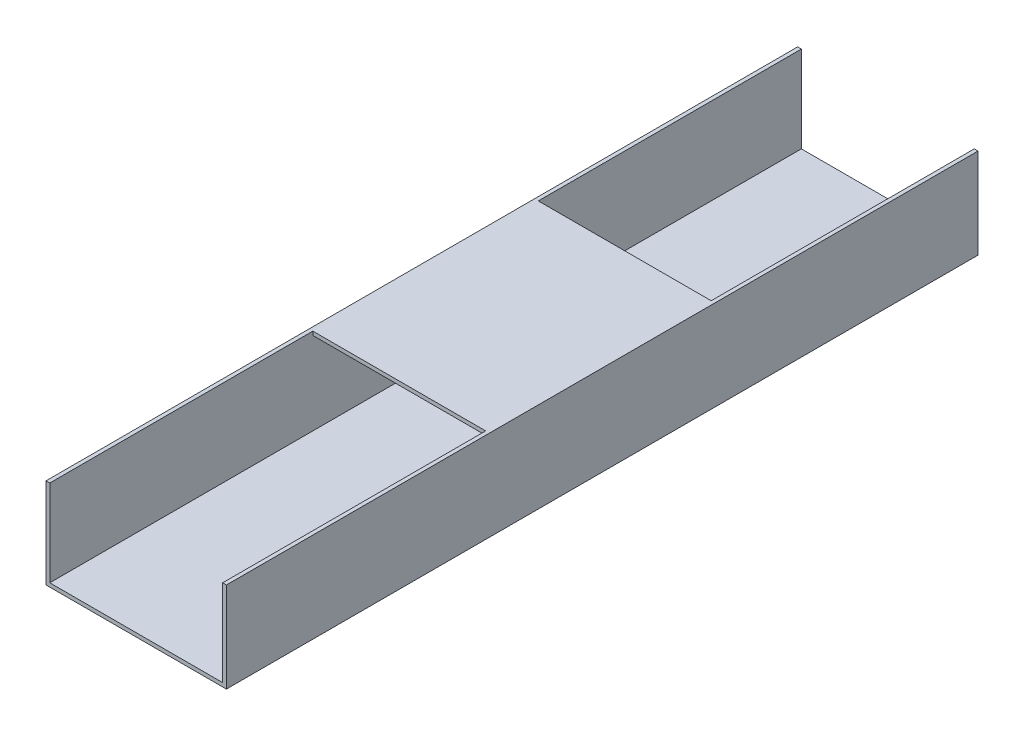
ISO-10303-21;
HEADER;
FILE_DESCRIPTION(('STEP AP214'),'2;1');
FILE_NAME('part.step','',(''),(''),'','','');
FILE_SCHEMA(('AUTOMOTIVE_DESIGN { 1 0 10303 214 1 1 1 1 }'));
ENDSEC;
DATA;
#1=APPLICATION_CONTEXT('core data for automotive mechanical design processes');
#2=APPLICATION_PROTOCOL_DEFINITION('international standard','automotive_design',2000,#1);
#3=PRODUCT_CONTEXT('',#1,'mechanical');
#4=PRODUCT('Part','Part','',(#3));
#5=PRODUCT_RELATED_PRODUCT_CATEGORY('part','',(#4));
#6=PRODUCT_DEFINITION_FORMATION('','',#4);
#7=PRODUCT_DEFINITION_CONTEXT('part definition',#1,'design');
#8=PRODUCT_DEFINITION('design','',#6,#7);
#9=PRODUCT_DEFINITION_SHAPE('','',#8);
#10=(LENGTH_UNIT() NAMED_UNIT(*) SI_UNIT(.MILLI.,.METRE.));
#11=(NAMED_UNIT(*) PLANE_ANGLE_UNIT() SI_UNIT($,.RADIAN.));
#12=(NAMED_UNIT(*) SI_UNIT($,.STERADIAN.) SOLID_ANGLE_UNIT());
#13=UNCERTAINTY_MEASURE_WITH_UNIT(LENGTH_MEASURE(1.E-05),#10,'distance_accuracy_value','');
#14=(GEOMETRIC_REPRESENTATION_CONTEXT(3) GLOBAL_UNCERTAINTY_ASSIGNED_CONTEXT((#13)) GLOBAL_UNIT_ASSIGNED_CONTEXT((#10,
#11,#12)) REPRESENTATION_CONTEXT('',''));
#15=CARTESIAN_POINT('',(0.,0.,0.));
#16=DIRECTION('',(0.,0.,1.));
#17=DIRECTION('',(1.,0.,0.));
#18=AXIS2_PLACEMENT_3D('',#15,#16,#17);
#19=CARTESIAN_POINT('',(0.,0.,200.));
#20=DIRECTION('',(0.,0.,-1.));
#21=DIRECTION('',(-1.,0.,0.));
#22=AXIS2_PLACEMENT_3D('',#19,#20,#21);
#23=PLANE('',#22);
#24=DIRECTION('',(0.,-1.,0.));
#25=VECTOR('',#24,1.);
#26=CARTESIAN_POINT('',(-23.,-11.,200.));
#27=LINE('',#26,#25);
#28=CARTESIAN_POINT('',(-22.9999999999999,12.,200.));
#29=VERTEX_POINT('',#28);
#30=CARTESIAN_POINT('',(-23.,-11.,200.));
#31=VERTEX_POINT('',#30);
#32=EDGE_CURVE('E142',#29,#31,#27,.T.);
#33=ORIENTED_EDGE('',*,*,#32,.F.);
#34=DIRECTION('',(-1.,0.,0.));
#35=VECTOR('',#34,1.);
#36=CARTESIAN_POINT('',(-24.,12.,200.));
#37=LINE('',#36,#35);
#38=CARTESIAN_POINT('',(-24.,12.,200.));
#39=VERTEX_POINT('',#38);
#40=EDGE_CURVE('E215',#29,#39,#37,.T.);
#41=ORIENTED_EDGE('',*,*,#40,.T.);
#42=DIRECTION('',(0.,-1.,0.));
#43=VECTOR('',#42,1.);
#44=CARTESIAN_POINT('',(-24.,-12.,200.));
#45=LINE('',#44,#43);
#46=CARTESIAN_POINT('',(-24.,-12.,200.));
#47=VERTEX_POINT('',#46);
#48=EDGE_CURVE('E220',#39,#47,#45,.T.);
#49=ORIENTED_EDGE('',*,*,#48,.T.);
#50=DIRECTION('',(1.,0.,0.));
#51=VECTOR('',#50,1.);
#52=CARTESIAN_POINT('',(-24.,-12.,200.));
#53=LINE('',#52,#51);
#54=CARTESIAN_POINT('',(24.,-12.,200.));
#55=VERTEX_POINT('',#54);
#56=EDGE_CURVE('E179',#47,#55,#53,.T.);
#57=ORIENTED_EDGE('',*,*,#56,.T.);
#58=DIRECTION('',(0.,1.,0.));
#59=VECTOR('',#58,1.);
#60=CARTESIAN_POINT('',(24.,-12.,200.));
#61=LINE('',#60,#59);
#62=CARTESIAN_POINT('',(24.,12.,200.));
#63=VERTEX_POINT('',#62);
#64=EDGE_CURVE('E173',#55,#63,#61,.T.);
#65=ORIENTED_EDGE('',*,*,#64,.T.);
#66=CARTESIAN_POINT('',(23.,12.,200.));
#67=VERTEX_POINT('',#66);
#68=EDGE_CURVE('E216',#63,#67,#37,.T.);
#69=ORIENTED_EDGE('',*,*,#68,.T.);
#70=DIRECTION('',(0.,1.,0.));
#71=VECTOR('',#70,1.);
#72=CARTESIAN_POINT('',(23.,-11.,200.));
#73=LINE('',#72,#71);
#74=CARTESIAN_POINT('',(23.,-11.,200.));
#75=VERTEX_POINT('',#74);
#76=EDGE_CURVE('E207',#75,#67,#73,.T.);
#77=ORIENTED_EDGE('',*,*,#76,.F.);
#78=DIRECTION('',(1.,0.,0.));
#79=VECTOR('',#78,1.);
#80=CARTESIAN_POINT('',(-23.,-11.,200.));
#81=LINE('',#80,#79);
#82=EDGE_CURVE('E269',#31,#75,#81,.T.);
#83=ORIENTED_EDGE('',*,*,#82,.F.);
#84=EDGE_LOOP('',(#33,#41,#49,#57,#65,#69,#77,#83));
#85=FACE_BOUND('',#84,.T.);
#86=ADVANCED_FACE('F39',(#85),#23,.F.);
#87=CARTESIAN_POINT('',(0.,0.,0.));
#88=DIRECTION('',(0.,0.,-1.));
#89=DIRECTION('',(-1.,0.,0.));
#90=AXIS2_PLACEMENT_3D('',#87,#88,#89);
#91=PLANE('',#90);
#92=DIRECTION('',(0.,1.,0.));
#93=VECTOR('',#92,1.);
#94=CARTESIAN_POINT('',(23.,-11.,0.));
#95=LINE('',#94,#93);
#96=CARTESIAN_POINT('',(23.,-11.,0.));
#97=VERTEX_POINT('',#96);
#98=CARTESIAN_POINT('',(23.,12.,0.));
#99=VERTEX_POINT('',#98);
#100=EDGE_CURVE('E130',#97,#99,#95,.T.);
#101=ORIENTED_EDGE('',*,*,#100,.T.);
#102=DIRECTION('',(-1.,0.,0.));
#103=VECTOR('',#102,1.);
#104=CARTESIAN_POINT('',(-24.,12.,0.));
#105=LINE('',#104,#103);
#106=CARTESIAN_POINT('',(24.,12.,0.));
#107=VERTEX_POINT('',#106);
#108=EDGE_CURVE('E135',#107,#99,#105,.T.);
#109=ORIENTED_EDGE('',*,*,#108,.F.);
#110=DIRECTION('',(0.,1.,0.));
#111=VECTOR('',#110,1.);
#112=CARTESIAN_POINT('',(24.,-12.,0.));
#113=LINE('',#112,#111);
#114=CARTESIAN_POINT('',(24.,-12.,0.));
#115=VERTEX_POINT('',#114);
#116=EDGE_CURVE('E167',#115,#107,#113,.T.);
#117=ORIENTED_EDGE('',*,*,#116,.F.);
#118=DIRECTION('',(1.,0.,0.));
#119=VECTOR('',#118,1.);
#120=CARTESIAN_POINT('',(-24.,-12.,0.));
#121=LINE('',#120,#119);
#122=CARTESIAN_POINT('',(-24.,-12.,0.));
#123=VERTEX_POINT('',#122);
#124=EDGE_CURVE('E165',#123,#115,#121,.T.);
#125=ORIENTED_EDGE('',*,*,#124,.F.);
#126=DIRECTION('',(0.,-1.,0.));
#127=VECTOR('',#126,1.);
#128=CARTESIAN_POINT('',(-24.,-12.,0.));
#129=LINE('',#128,#127);
#130=CARTESIAN_POINT('',(-24.,12.,0.));
#131=VERTEX_POINT('',#130);
#132=EDGE_CURVE('E160',#131,#123,#129,.T.);
#133=ORIENTED_EDGE('',*,*,#132,.F.);
#134=CARTESIAN_POINT('',(-23.,12.,0.));
#135=VERTEX_POINT('',#134);
#136=EDGE_CURVE('E161',#135,#131,#105,.T.);
#137=ORIENTED_EDGE('',*,*,#136,.F.);
#138=DIRECTION('',(0.,-1.,0.));
#139=VECTOR('',#138,1.);
#140=CARTESIAN_POINT('',(-23.,-11.,0.));
#141=LINE('',#140,#139);
#142=CARTESIAN_POINT('',(-23.,-11.,0.));
#143=VERTEX_POINT('',#142);
#144=EDGE_CURVE('E250',#135,#143,#141,.T.);
#145=ORIENTED_EDGE('',*,*,#144,.T.);
#146=DIRECTION('',(1.,0.,0.));
#147=VECTOR('',#146,1.);
#148=CARTESIAN_POINT('',(-23.,-11.,0.));
#149=LINE('',#148,#147);
#150=EDGE_CURVE('E139',#143,#97,#149,.T.);
#151=ORIENTED_EDGE('',*,*,#150,.T.);
#152=EDGE_LOOP('',(#101,#109,#117,#125,#133,#137,#145,#151));
#153=FACE_BOUND('',#152,.T.);
#154=ADVANCED_FACE('F132',(#153),#91,.T.);
#155=CARTESIAN_POINT('',(24.,-12.,200.));
#156=DIRECTION('',(-1.,0.,0.));
#157=DIRECTION('',(0.,0.,1.));
#158=AXIS2_PLACEMENT_3D('',#155,#156,#157);
#159=PLANE('',#158);
#160=ORIENTED_EDGE('',*,*,#116,.T.);
#161=DIRECTION('',(0.,0.,-1.));
#162=VECTOR('',#161,1.);
#163=CARTESIAN_POINT('',(24.,12.,200.));
#164=LINE('',#163,#162);
#165=EDGE_CURVE('E157',#63,#107,#164,.T.);
#166=ORIENTED_EDGE('',*,*,#165,.F.);
#167=ORIENTED_EDGE('',*,*,#64,.F.);
#168=DIRECTION('',(0.,0.,-1.));
#169=VECTOR('',#168,1.);
#170=CARTESIAN_POINT('',(24.,-12.,200.));
#171=LINE('',#170,#169);
#172=EDGE_CURVE('E174',#55,#115,#171,.T.);
#173=ORIENTED_EDGE('',*,*,#172,.T.);
#174=EDGE_LOOP('',(#160,#166,#167,#173));
#175=FACE_BOUND('',#174,.T.);
#176=ADVANCED_FACE('F41',(#175),#159,.F.);
#177=CARTESIAN_POINT('',(-24.,12.,200.));
#178=DIRECTION('',(0.,-1.,0.));
#179=DIRECTION('',(0.,0.,-1.));
#180=AXIS2_PLACEMENT_3D('',#177,#178,#179);
#181=PLANE('',#180);
#182=ORIENTED_EDGE('',*,*,#108,.T.);
#183=DIRECTION('',(0.,0.,-1.));
#184=VECTOR('',#183,1.);
#185=CARTESIAN_POINT('',(23.,12.,70.));
#186=LINE('',#185,#184);
#187=CARTESIAN_POINT('',(23.,12.,70.));
#188=VERTEX_POINT('',#187);
#189=EDGE_CURVE('E145',#188,#99,#186,.T.);
#190=ORIENTED_EDGE('',*,*,#189,.F.);
#191=DIRECTION('',(1.,0.,0.));
#192=VECTOR('',#191,1.);
#193=CARTESIAN_POINT('',(-23.,12.,70.));
#194=LINE('',#193,#192);
#195=CARTESIAN_POINT('',(-23.,12.,70.));
#196=VERTEX_POINT('',#195);
#197=EDGE_CURVE('E242',#196,#188,#194,.T.);
#198=ORIENTED_EDGE('',*,*,#197,.F.);
#199=DIRECTION('',(0.,0.,1.));
#200=VECTOR('',#199,1.);
#201=CARTESIAN_POINT('',(-23.,12.,70.));
#202=LINE('',#201,#200);
#203=EDGE_CURVE('E152',#135,#196,#202,.T.);
#204=ORIENTED_EDGE('',*,*,#203,.F.);
#205=ORIENTED_EDGE('',*,*,#136,.T.);
#206=DIRECTION('',(0.,0.,-1.));
#207=VECTOR('',#206,1.);
#208=CARTESIAN_POINT('',(-24.,12.,200.));
#209=LINE('',#208,#207);
#210=EDGE_CURVE('E183',#39,#131,#209,.T.);
#211=ORIENTED_EDGE('',*,*,#210,.F.);
#212=ORIENTED_EDGE('',*,*,#40,.F.);
#213=DIRECTION('',(0.,0.,1.));
#214=VECTOR('',#213,1.);
#215=CARTESIAN_POINT('',(-23.,12.,130.));
#216=LINE('',#215,#214);
#217=CARTESIAN_POINT('',(-23.,12.,130.));
#218=VERTEX_POINT('',#217);
#219=EDGE_CURVE('E253',#218,#29,#216,.T.);
#220=ORIENTED_EDGE('',*,*,#219,.F.);
#221=DIRECTION('',(-1.,0.,0.));
#222=VECTOR('',#221,1.);
#223=CARTESIAN_POINT('',(-23.,12.,130.));
#224=LINE('',#223,#222);
#225=CARTESIAN_POINT('',(23.,12.,130.));
#226=VERTEX_POINT('',#225);
#227=EDGE_CURVE('E260',#226,#218,#224,.T.);
#228=ORIENTED_EDGE('',*,*,#227,.F.);
#229=DIRECTION('',(0.,0.,-1.));
#230=VECTOR('',#229,1.);
#231=CARTESIAN_POINT('',(23.,12.,130.));
#232=LINE('',#231,#230);
#233=EDGE_CURVE('E257',#67,#226,#232,.T.);
#234=ORIENTED_EDGE('',*,*,#233,.F.);
#235=ORIENTED_EDGE('',*,*,#68,.F.);
#236=ORIENTED_EDGE('',*,*,#165,.T.);
#237=EDGE_LOOP('',(#182,#190,#198,#204,#205,#211,#212,#220,#228,#234,#235,#236));
#238=FACE_BOUND('',#237,.T.);
#239=ADVANCED_FACE('F155',(#238),#181,.F.);
#240=CARTESIAN_POINT('',(-24.,-12.,200.));
#241=DIRECTION('',(1.,0.,0.));
#242=DIRECTION('',(0.,0.,-1.));
#243=AXIS2_PLACEMENT_3D('',#240,#241,#242);
#244=PLANE('',#243);
#245=ORIENTED_EDGE('',*,*,#132,.T.);
#246=DIRECTION('',(0.,0.,-1.));
#247=VECTOR('',#246,1.);
#248=CARTESIAN_POINT('',(-24.,-12.,200.));
#249=LINE('',#248,#247);
#250=EDGE_CURVE('E178',#47,#123,#249,.T.);
#251=ORIENTED_EDGE('',*,*,#250,.F.);
#252=ORIENTED_EDGE('',*,*,#48,.F.);
#253=ORIENTED_EDGE('',*,*,#210,.T.);
#254=EDGE_LOOP('',(#245,#251,#252,#253));
#255=FACE_BOUND('',#254,.T.);
#256=ADVANCED_FACE('F237',(#255),#244,.F.);
#257=CARTESIAN_POINT('',(-24.,-12.,200.));
#258=DIRECTION('',(0.,1.,0.));
#259=DIRECTION('',(0.,0.,1.));
#260=AXIS2_PLACEMENT_3D('',#257,#258,#259);
#261=PLANE('',#260);
#262=ORIENTED_EDGE('',*,*,#124,.T.);
#263=ORIENTED_EDGE('',*,*,#172,.F.);
#264=ORIENTED_EDGE('',*,*,#56,.F.);
#265=ORIENTED_EDGE('',*,*,#250,.T.);
#266=EDGE_LOOP('',(#262,#263,#264,#265));
#267=FACE_BOUND('',#266,.T.);
#268=ADVANCED_FACE('F230',(#267),#261,.F.);
#269=CARTESIAN_POINT('',(-23.,-11.,200.));
#270=DIRECTION('',(1.,0.,0.));
#271=DIRECTION('',(0.,0.,-1.));
#272=AXIS2_PLACEMENT_3D('',#269,#270,#271);
#273=PLANE('',#272);
#274=DIRECTION('',(0.,0.,-1.));
#275=VECTOR('',#274,1.);
#276=CARTESIAN_POINT('',(-23.,-11.,200.));
#277=LINE('',#276,#275);
#278=EDGE_CURVE('E205',#31,#143,#277,.T.);
#279=ORIENTED_EDGE('',*,*,#278,.T.);
#280=ORIENTED_EDGE('',*,*,#144,.F.);
#281=ORIENTED_EDGE('',*,*,#203,.T.);
#282=DIRECTION('',(0.,1.,0.));
#283=VECTOR('',#282,1.);
#284=CARTESIAN_POINT('',(-23.,-11.,70.));
#285=LINE('',#284,#283);
#286=CARTESIAN_POINT('',(-23.,11.,70.));
#287=VERTEX_POINT('',#286);
#288=EDGE_CURVE('E55',#287,#196,#285,.T.);
#289=ORIENTED_EDGE('',*,*,#288,.F.);
#290=DIRECTION('',(0.,0.,-1.));
#291=VECTOR('',#290,1.);
#292=CARTESIAN_POINT('',(-23.,11.,200.));
#293=LINE('',#292,#291);
#294=CARTESIAN_POINT('',(-23.,11.,130.));
#295=VERTEX_POINT('',#294);
#296=EDGE_CURVE('E201',#295,#287,#293,.T.);
#297=ORIENTED_EDGE('',*,*,#296,.F.);
#298=DIRECTION('',(0.,1.,0.));
#299=VECTOR('',#298,1.);
#300=CARTESIAN_POINT('',(-23.,-11.,130.));
#301=LINE('',#300,#299);
#302=EDGE_CURVE('E153',#295,#218,#301,.T.);
#303=ORIENTED_EDGE('',*,*,#302,.T.);
#304=ORIENTED_EDGE('',*,*,#219,.T.);
#305=ORIENTED_EDGE('',*,*,#32,.T.);
#306=EDGE_LOOP('',(#279,#280,#281,#289,#297,#303,#304,#305));
#307=FACE_BOUND('',#306,.T.);
#308=ADVANCED_FACE('F277',(#307),#273,.T.);
#309=CARTESIAN_POINT('',(-23.,-11.,200.));
#310=DIRECTION('',(0.,1.,0.));
#311=DIRECTION('',(-1.,0.,0.));
#312=AXIS2_PLACEMENT_3D('',#309,#310,#311);
#313=PLANE('',#312);
#314=DIRECTION('',(0.,0.,-1.));
#315=VECTOR('',#314,1.);
#316=CARTESIAN_POINT('',(23.,-11.,200.));
#317=LINE('',#316,#315);
#318=EDGE_CURVE('E200',#75,#97,#317,.T.);
#319=ORIENTED_EDGE('',*,*,#318,.T.);
#320=ORIENTED_EDGE('',*,*,#150,.F.);
#321=ORIENTED_EDGE('',*,*,#278,.F.);
#322=ORIENTED_EDGE('',*,*,#82,.T.);
#323=EDGE_LOOP('',(#319,#320,#321,#322));
#324=FACE_BOUND('',#323,.T.);
#325=ADVANCED_FACE('F281',(#324),#313,.T.);
#326=CARTESIAN_POINT('',(23.,-11.,200.));
#327=DIRECTION('',(-1.,0.,0.));
#328=DIRECTION('',(0.,0.,1.));
#329=AXIS2_PLACEMENT_3D('',#326,#327,#328);
#330=PLANE('',#329);
#331=DIRECTION('',(0.,0.,-1.));
#332=VECTOR('',#331,1.);
#333=CARTESIAN_POINT('',(23.,11.,200.));
#334=LINE('',#333,#332);
#335=CARTESIAN_POINT('',(23.,11.,130.));
#336=VERTEX_POINT('',#335);
#337=CARTESIAN_POINT('',(23.,11.,70.));
#338=VERTEX_POINT('',#337);
#339=EDGE_CURVE('E197',#336,#338,#334,.T.);
#340=ORIENTED_EDGE('',*,*,#339,.T.);
#341=DIRECTION('',(0.,1.,0.));
#342=VECTOR('',#341,1.);
#343=CARTESIAN_POINT('',(23.,-11.,70.));
#344=LINE('',#343,#342);
#345=EDGE_CURVE('E147',#338,#188,#344,.T.);
#346=ORIENTED_EDGE('',*,*,#345,.T.);
#347=ORIENTED_EDGE('',*,*,#189,.T.);
#348=ORIENTED_EDGE('',*,*,#100,.F.);
#349=ORIENTED_EDGE('',*,*,#318,.F.);
#350=ORIENTED_EDGE('',*,*,#76,.T.);
#351=ORIENTED_EDGE('',*,*,#233,.T.);
#352=DIRECTION('',(0.,1.,0.));
#353=VECTOR('',#352,1.);
#354=CARTESIAN_POINT('',(23.,-11.,130.));
#355=LINE('',#354,#353);
#356=EDGE_CURVE('E62',#336,#226,#355,.T.);
#357=ORIENTED_EDGE('',*,*,#356,.F.);
#358=EDGE_LOOP('',(#340,#346,#347,#348,#349,#350,#351,#357));
#359=FACE_BOUND('',#358,.T.);
#360=ADVANCED_FACE('F146',(#359),#330,.T.);
#361=CARTESIAN_POINT('',(-23.,11.,200.));
#362=DIRECTION('',(0.,-1.,0.));
#363=DIRECTION('',(0.,0.,-1.));
#364=AXIS2_PLACEMENT_3D('',#361,#362,#363);
#365=PLANE('',#364);
#366=DIRECTION('',(-1.,0.,0.));
#367=VECTOR('',#366,1.);
#368=CARTESIAN_POINT('',(-23.,11.,70.));
#369=LINE('',#368,#367);
#370=EDGE_CURVE('E11',#338,#287,#369,.T.);
#371=ORIENTED_EDGE('',*,*,#370,.F.);
#372=ORIENTED_EDGE('',*,*,#339,.F.);
#373=DIRECTION('',(1.,0.,0.));
#374=VECTOR('',#373,1.);
#375=CARTESIAN_POINT('',(-23.,11.,130.));
#376=LINE('',#375,#374);
#377=EDGE_CURVE('E48',#295,#336,#376,.T.);
#378=ORIENTED_EDGE('',*,*,#377,.F.);
#379=ORIENTED_EDGE('',*,*,#296,.T.);
#380=EDGE_LOOP('',(#371,#372,#378,#379));
#381=FACE_BOUND('',#380,.T.);
#382=ADVANCED_FACE('F198',(#381),#365,.T.);
#383=CARTESIAN_POINT('',(-23.,-11.,130.));
#384=DIRECTION('',(0.,0.,-1.));
#385=DIRECTION('',(-1.,0.,0.));
#386=AXIS2_PLACEMENT_3D('',#383,#384,#385);
#387=PLANE('',#386);
#388=ORIENTED_EDGE('',*,*,#377,.T.);
#389=ORIENTED_EDGE('',*,*,#356,.T.);
#390=ORIENTED_EDGE('',*,*,#227,.T.);
#391=ORIENTED_EDGE('',*,*,#302,.F.);
#392=EDGE_LOOP('',(#388,#389,#390,#391));
#393=FACE_BOUND('',#392,.T.);
#394=ADVANCED_FACE('F192',(#393),#387,.F.);
#395=CARTESIAN_POINT('',(-23.,-11.,70.));
#396=DIRECTION('',(0.,0.,1.));
#397=DIRECTION('',(1.,0.,0.));
#398=AXIS2_PLACEMENT_3D('',#395,#396,#397);
#399=PLANE('',#398);
#400=ORIENTED_EDGE('',*,*,#370,.T.);
#401=ORIENTED_EDGE('',*,*,#288,.T.);
#402=ORIENTED_EDGE('',*,*,#197,.T.);
#403=ORIENTED_EDGE('',*,*,#345,.F.);
#404=EDGE_LOOP('',(#400,#401,#402,#403));
#405=FACE_BOUND('',#404,.T.);
#406=ADVANCED_FACE('F360',(#405),#399,.F.);
#407=CLOSED_SHELL('',(#86,#154,#176,#239,#256,#268,#308,#325,#360,#382,#394,#406));
#408=MANIFOLD_SOLID_BREP('B2',#407);
#409=ADVANCED_BREP_SHAPE_REPRESENTATION('',(#18,#408),#14);
#410=SHAPE_DEFINITION_REPRESENTATION(#9,#409);
ENDSEC;
END-ISO-10303-21;
